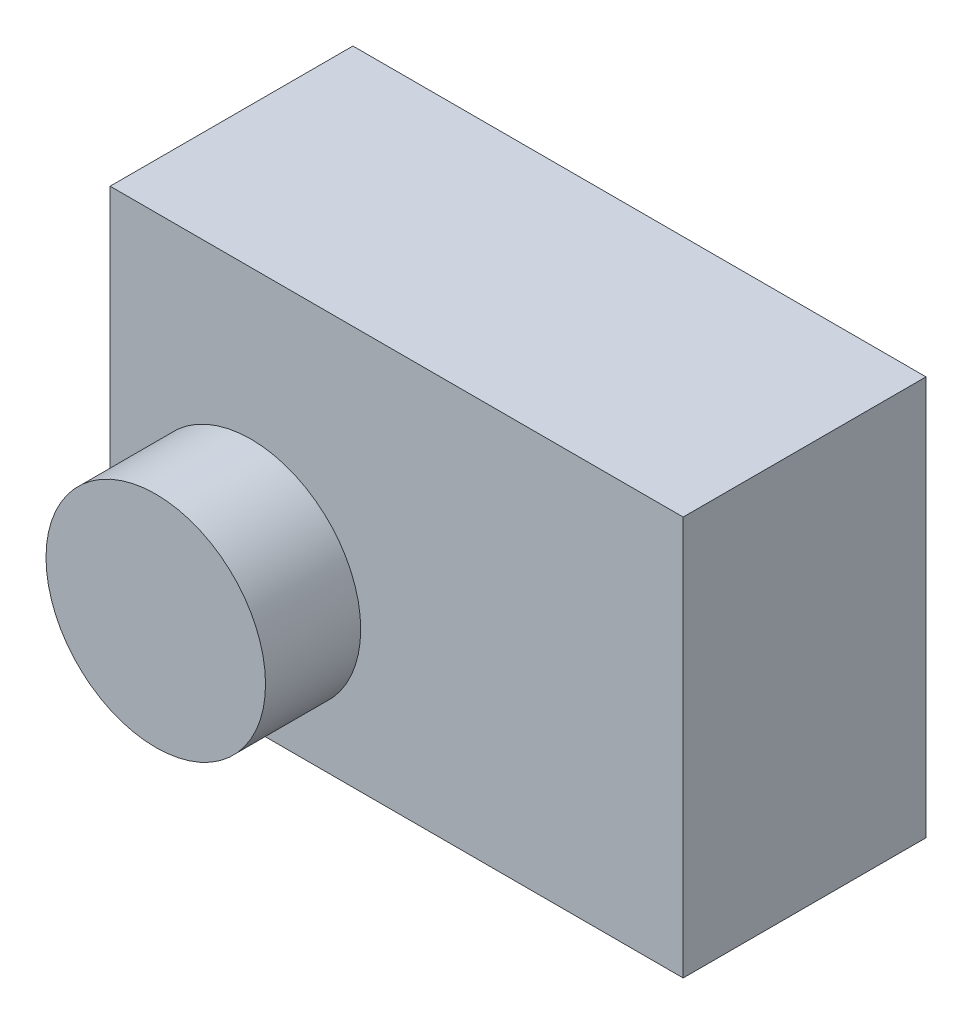
ISO-10303-21;
HEADER;
FILE_DESCRIPTION(('STEP AP214'),'2;1');
FILE_NAME('part.step','',(''),(''),'','','');
FILE_SCHEMA(('AUTOMOTIVE_DESIGN { 1 0 10303 214 1 1 1 1 }'));
ENDSEC;
DATA;
#1=APPLICATION_CONTEXT('core data for automotive mechanical design processes');
#2=APPLICATION_PROTOCOL_DEFINITION('international standard','automotive_design',2000,#1);
#3=PRODUCT_CONTEXT('',#1,'mechanical');
#4=PRODUCT('Part','Part','',(#3));
#5=PRODUCT_RELATED_PRODUCT_CATEGORY('part','',(#4));
#6=PRODUCT_DEFINITION_FORMATION('','',#4);
#7=PRODUCT_DEFINITION_CONTEXT('part definition',#1,'design');
#8=PRODUCT_DEFINITION('design','',#6,#7);
#9=PRODUCT_DEFINITION_SHAPE('','',#8);
#10=(LENGTH_UNIT() NAMED_UNIT(*) SI_UNIT(.MILLI.,.METRE.));
#11=(NAMED_UNIT(*) PLANE_ANGLE_UNIT() SI_UNIT($,.RADIAN.));
#12=(NAMED_UNIT(*) SI_UNIT($,.STERADIAN.) SOLID_ANGLE_UNIT());
#13=UNCERTAINTY_MEASURE_WITH_UNIT(LENGTH_MEASURE(1.E-05),#10,'distance_accuracy_value','');
#14=(GEOMETRIC_REPRESENTATION_CONTEXT(3) GLOBAL_UNCERTAINTY_ASSIGNED_CONTEXT((#13)) GLOBAL_UNIT_ASSIGNED_CONTEXT((#10,
#11,#12)) REPRESENTATION_CONTEXT('',''));
#15=CARTESIAN_POINT('',(0.,0.,0.));
#16=DIRECTION('',(0.,0.,1.));
#17=DIRECTION('',(1.,0.,0.));
#18=AXIS2_PLACEMENT_3D('',#15,#16,#17);
#19=CARTESIAN_POINT('',(-29.5,-20.55,25.));
#20=DIRECTION('',(1.,0.,0.));
#21=DIRECTION('',(0.,0.,-1.));
#22=AXIS2_PLACEMENT_3D('',#19,#20,#21);
#23=PLANE('',#22);
#24=DIRECTION('',(0.,-1.,0.));
#25=VECTOR('',#24,1.);
#26=CARTESIAN_POINT('',(-29.5,-20.55,0.));
#27=LINE('',#26,#25);
#28=CARTESIAN_POINT('',(-29.5,20.55,0.));
#29=VERTEX_POINT('',#28);
#30=CARTESIAN_POINT('',(-29.5,-20.55,0.));
#31=VERTEX_POINT('',#30);
#32=EDGE_CURVE('E110',#29,#31,#27,.T.);
#33=ORIENTED_EDGE('',*,*,#32,.T.);
#34=DIRECTION('',(0.,0.,-1.));
#35=VECTOR('',#34,1.);
#36=CARTESIAN_POINT('',(-29.5,-20.55,25.));
#37=LINE('',#36,#35);
#38=CARTESIAN_POINT('',(-29.5,-20.55,25.));
#39=VERTEX_POINT('',#38);
#40=EDGE_CURVE('E42',#39,#31,#37,.T.);
#41=ORIENTED_EDGE('',*,*,#40,.F.);
#42=DIRECTION('',(0.,-1.,0.));
#43=VECTOR('',#42,1.);
#44=CARTESIAN_POINT('',(-29.5,-20.55,25.));
#45=LINE('',#44,#43);
#46=CARTESIAN_POINT('',(-29.5,20.55,25.));
#47=VERTEX_POINT('',#46);
#48=EDGE_CURVE('E94',#47,#39,#45,.T.);
#49=ORIENTED_EDGE('',*,*,#48,.F.);
#50=DIRECTION('',(0.,0.,-1.));
#51=VECTOR('',#50,1.);
#52=CARTESIAN_POINT('',(-29.5,20.55,25.));
#53=LINE('',#52,#51);
#54=EDGE_CURVE('E103',#47,#29,#53,.T.);
#55=ORIENTED_EDGE('',*,*,#54,.T.);
#56=EDGE_LOOP('',(#33,#41,#49,#55));
#57=FACE_BOUND('',#56,.T.);
#58=ADVANCED_FACE('F41',(#57),#23,.F.);
#59=CARTESIAN_POINT('',(29.5,-20.55,25.));
#60=DIRECTION('',(0.,1.,0.));
#61=DIRECTION('',(-1.,0.,0.));
#62=AXIS2_PLACEMENT_3D('',#59,#60,#61);
#63=PLANE('',#62);
#64=DIRECTION('',(1.,0.,0.));
#65=VECTOR('',#64,1.);
#66=CARTESIAN_POINT('',(29.5,-20.55,0.));
#67=LINE('',#66,#65);
#68=CARTESIAN_POINT('',(29.5,-20.55,0.));
#69=VERTEX_POINT('',#68);
#70=EDGE_CURVE('E97',#31,#69,#67,.T.);
#71=ORIENTED_EDGE('',*,*,#70,.T.);
#72=DIRECTION('',(0.,0.,-1.));
#73=VECTOR('',#72,1.);
#74=CARTESIAN_POINT('',(29.5,-20.55,25.));
#75=LINE('',#74,#73);
#76=CARTESIAN_POINT('',(29.5,-20.55,25.));
#77=VERTEX_POINT('',#76);
#78=EDGE_CURVE('E100',#77,#69,#75,.T.);
#79=ORIENTED_EDGE('',*,*,#78,.F.);
#80=DIRECTION('',(1.,0.,0.));
#81=VECTOR('',#80,1.);
#82=CARTESIAN_POINT('',(29.5,-20.55,25.));
#83=LINE('',#82,#81);
#84=EDGE_CURVE('E90',#39,#77,#83,.T.);
#85=ORIENTED_EDGE('',*,*,#84,.F.);
#86=ORIENTED_EDGE('',*,*,#40,.T.);
#87=EDGE_LOOP('',(#71,#79,#85,#86));
#88=FACE_BOUND('',#87,.T.);
#89=ADVANCED_FACE('F98',(#88),#63,.F.);
#90=CARTESIAN_POINT('',(29.5,-20.55,25.));
#91=DIRECTION('',(-1.,0.,0.));
#92=DIRECTION('',(0.,0.,1.));
#93=AXIS2_PLACEMENT_3D('',#90,#91,#92);
#94=PLANE('',#93);
#95=DIRECTION('',(0.,1.,0.));
#96=VECTOR('',#95,1.);
#97=CARTESIAN_POINT('',(29.5,-20.55,0.));
#98=LINE('',#97,#96);
#99=CARTESIAN_POINT('',(29.5,20.55,0.));
#100=VERTEX_POINT('',#99);
#101=EDGE_CURVE('E73',#69,#100,#98,.T.);
#102=ORIENTED_EDGE('',*,*,#101,.T.);
#103=DIRECTION('',(0.,0.,-1.));
#104=VECTOR('',#103,1.);
#105=CARTESIAN_POINT('',(29.5,20.55,25.));
#106=LINE('',#105,#104);
#107=CARTESIAN_POINT('',(29.5,20.55,25.));
#108=VERTEX_POINT('',#107);
#109=EDGE_CURVE('E99',#108,#100,#106,.T.);
#110=ORIENTED_EDGE('',*,*,#109,.F.);
#111=DIRECTION('',(0.,1.,0.));
#112=VECTOR('',#111,1.);
#113=CARTESIAN_POINT('',(29.5,-20.55,25.));
#114=LINE('',#113,#112);
#115=EDGE_CURVE('E95',#77,#108,#114,.T.);
#116=ORIENTED_EDGE('',*,*,#115,.F.);
#117=ORIENTED_EDGE('',*,*,#78,.T.);
#118=EDGE_LOOP('',(#102,#110,#116,#117));
#119=FACE_BOUND('',#118,.T.);
#120=ADVANCED_FACE('F101',(#119),#94,.F.);
#121=CARTESIAN_POINT('',(29.5,20.55,25.));
#122=DIRECTION('',(0.,-1.,0.));
#123=DIRECTION('',(1.,0.,0.));
#124=AXIS2_PLACEMENT_3D('',#121,#122,#123);
#125=PLANE('',#124);
#126=DIRECTION('',(-1.,0.,0.));
#127=VECTOR('',#126,1.);
#128=CARTESIAN_POINT('',(29.5,20.55,0.));
#129=LINE('',#128,#127);
#130=EDGE_CURVE('E84',#100,#29,#129,.T.);
#131=ORIENTED_EDGE('',*,*,#130,.T.);
#132=ORIENTED_EDGE('',*,*,#54,.F.);
#133=DIRECTION('',(-1.,0.,0.));
#134=VECTOR('',#133,1.);
#135=CARTESIAN_POINT('',(29.5,20.55,25.));
#136=LINE('',#135,#134);
#137=EDGE_CURVE('E59',#108,#47,#136,.T.);
#138=ORIENTED_EDGE('',*,*,#137,.F.);
#139=ORIENTED_EDGE('',*,*,#109,.T.);
#140=EDGE_LOOP('',(#131,#132,#138,#139));
#141=FACE_BOUND('',#140,.T.);
#142=ADVANCED_FACE('F113',(#141),#125,.F.);
#143=CARTESIAN_POINT('',(0.,0.,25.));
#144=DIRECTION('',(0.,0.,1.));
#145=DIRECTION('',(1.,0.,0.));
#146=AXIS2_PLACEMENT_3D('',#143,#144,#145);
#147=PLANE('',#146);
#148=CARTESIAN_POINT('',(-15.,-6.05,25.));
#149=DIRECTION('',(0.,0.,1.));
#150=DIRECTION('',(1.,0.,0.));
#151=AXIS2_PLACEMENT_3D('',#148,#149,#150);
#152=CIRCLE('',#151,11.3);
#153=CARTESIAN_POINT('',(-3.7,-6.05,25.));
#154=VERTEX_POINT('',#153);
#155=EDGE_CURVE('E11',#154,#154,#152,.T.);
#156=ORIENTED_EDGE('',*,*,#155,.F.);
#157=EDGE_LOOP('',(#156));
#158=FACE_BOUND('',#157,.T.);
#159=ORIENTED_EDGE('',*,*,#48,.T.);
#160=ORIENTED_EDGE('',*,*,#84,.T.);
#161=ORIENTED_EDGE('',*,*,#115,.T.);
#162=ORIENTED_EDGE('',*,*,#137,.T.);
#163=EDGE_LOOP('',(#159,#160,#161,#162));
#164=FACE_BOUND('',#163,.T.);
#165=ADVANCED_FACE('F89',(#158,#164),#147,.T.);
#166=CARTESIAN_POINT('',(0.,0.,0.));
#167=DIRECTION('',(0.,0.,1.));
#168=DIRECTION('',(1.,0.,0.));
#169=AXIS2_PLACEMENT_3D('',#166,#167,#168);
#170=PLANE('',#169);
#171=ORIENTED_EDGE('',*,*,#32,.F.);
#172=ORIENTED_EDGE('',*,*,#130,.F.);
#173=ORIENTED_EDGE('',*,*,#101,.F.);
#174=ORIENTED_EDGE('',*,*,#70,.F.);
#175=EDGE_LOOP('',(#171,#172,#173,#174));
#176=FACE_BOUND('',#175,.T.);
#177=ADVANCED_FACE('F119',(#176),#170,.F.);
#178=CARTESIAN_POINT('',(-15.,-6.05,34.8));
#179=DIRECTION('',(0.,0.,-1.));
#180=DIRECTION('',(-1.,0.,0.));
#181=AXIS2_PLACEMENT_3D('',#178,#179,#180);
#182=CYLINDRICAL_SURFACE('',#181,11.3);
#183=CARTESIAN_POINT('',(-15.,-6.05,34.8));
#184=DIRECTION('',(0.,0.,1.));
#185=DIRECTION('',(1.,0.,0.));
#186=AXIS2_PLACEMENT_3D('',#183,#184,#185);
#187=CIRCLE('',#186,11.3);
#188=CARTESIAN_POINT('',(-3.7,-6.05,34.8));
#189=VERTEX_POINT('',#188);
#190=EDGE_CURVE('E109',#189,#189,#187,.T.);
#191=ORIENTED_EDGE('',*,*,#190,.F.);
#192=EDGE_LOOP('',(#191));
#193=FACE_BOUND('',#192,.T.);
#194=ORIENTED_EDGE('',*,*,#155,.T.);
#195=EDGE_LOOP('',(#194));
#196=FACE_BOUND('',#195,.T.);
#197=ADVANCED_FACE('F127',(#193,#196),#182,.T.);
#198=CARTESIAN_POINT('',(-15.,-6.05,34.8));
#199=DIRECTION('',(0.,0.,1.));
#200=DIRECTION('',(1.,0.,0.));
#201=AXIS2_PLACEMENT_3D('',#198,#199,#200);
#202=PLANE('',#201);
#203=ORIENTED_EDGE('',*,*,#190,.T.);
#204=EDGE_LOOP('',(#203));
#205=FACE_BOUND('',#204,.T.);
#206=ADVANCED_FACE('F123',(#205),#202,.T.);
#207=CLOSED_SHELL('',(#58,#89,#120,#142,#165,#177,#197,#206));
#208=MANIFOLD_SOLID_BREP('B2',#207);
#209=ADVANCED_BREP_SHAPE_REPRESENTATION('',(#18,#208),#14);
#210=SHAPE_DEFINITION_REPRESENTATION(#9,#209);
ENDSEC;
END-ISO-10303-21;
